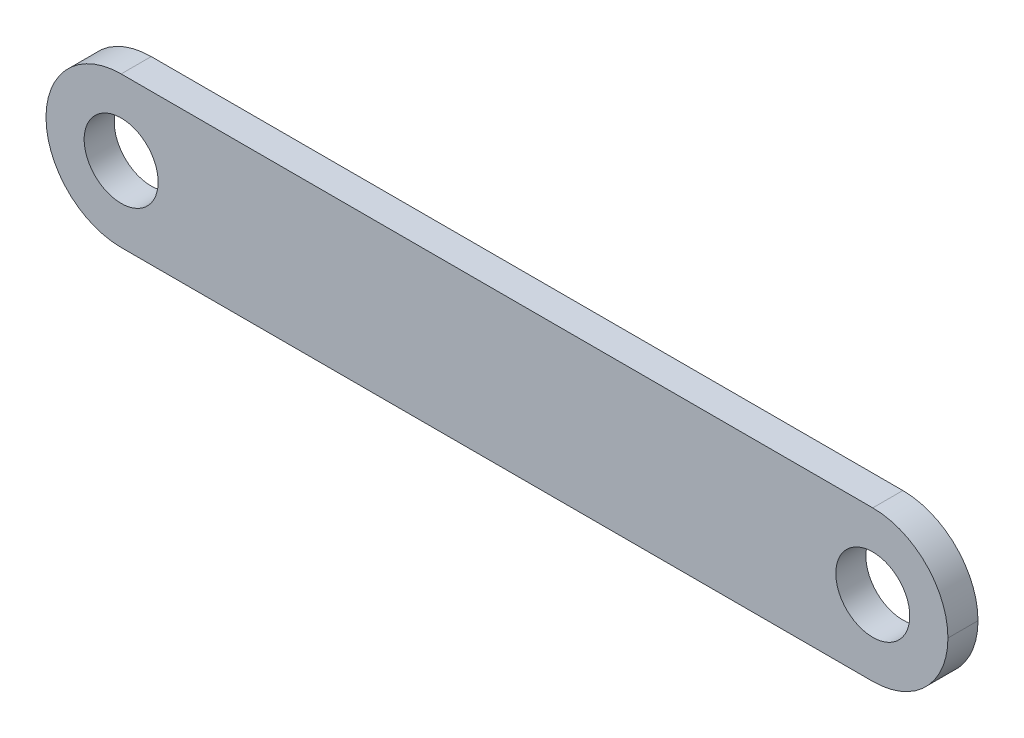
ISO-10303-21;
HEADER;
FILE_DESCRIPTION(('STEP AP214'),'2;1');
FILE_NAME('part.step','',(''),(''),'','','');
FILE_SCHEMA(('AUTOMOTIVE_DESIGN { 1 0 10303 214 1 1 1 1 }'));
ENDSEC;
DATA;
#1=APPLICATION_CONTEXT('core data for automotive mechanical design processes');
#2=APPLICATION_PROTOCOL_DEFINITION('international standard','automotive_design',2000,#1);
#3=PRODUCT_CONTEXT('',#1,'mechanical');
#4=PRODUCT('Part','Part','',(#3));
#5=PRODUCT_RELATED_PRODUCT_CATEGORY('part','',(#4));
#6=PRODUCT_DEFINITION_FORMATION('','',#4);
#7=PRODUCT_DEFINITION_CONTEXT('part definition',#1,'design');
#8=PRODUCT_DEFINITION('design','',#6,#7);
#9=PRODUCT_DEFINITION_SHAPE('','',#8);
#10=(LENGTH_UNIT() NAMED_UNIT(*) SI_UNIT(.MILLI.,.METRE.));
#11=(NAMED_UNIT(*) PLANE_ANGLE_UNIT() SI_UNIT($,.RADIAN.));
#12=(NAMED_UNIT(*) SI_UNIT($,.STERADIAN.) SOLID_ANGLE_UNIT());
#13=UNCERTAINTY_MEASURE_WITH_UNIT(LENGTH_MEASURE(1.E-05),#10,'distance_accuracy_value','');
#14=(GEOMETRIC_REPRESENTATION_CONTEXT(3) GLOBAL_UNCERTAINTY_ASSIGNED_CONTEXT((#13)) GLOBAL_UNIT_ASSIGNED_CONTEXT((#10,
#11,#12)) REPRESENTATION_CONTEXT('',''));
#15=CARTESIAN_POINT('',(0.,0.,0.));
#16=DIRECTION('',(0.,0.,1.));
#17=DIRECTION('',(1.,0.,0.));
#18=AXIS2_PLACEMENT_3D('',#15,#16,#17);
#19=CARTESIAN_POINT('',(-76.2,12.7,5.08));
#20=DIRECTION('',(0.,-1.,0.));
#21=DIRECTION('',(0.,0.,-1.));
#22=AXIS2_PLACEMENT_3D('',#19,#20,#21);
#23=PLANE('',#22);
#24=DIRECTION('',(-1.,0.,0.));
#25=VECTOR('',#24,1.);
#26=CARTESIAN_POINT('',(-76.2,12.7,0.));
#27=LINE('',#26,#25);
#28=CARTESIAN_POINT('',(63.4999999999999,12.7,0.));
#29=VERTEX_POINT('',#28);
#30=CARTESIAN_POINT('',(-63.5,12.7,0.));
#31=VERTEX_POINT('',#30);
#32=EDGE_CURVE('E126',#29,#31,#27,.T.);
#33=ORIENTED_EDGE('',*,*,#32,.T.);
#34=DIRECTION('',(0.,0.,-1.));
#35=VECTOR('',#34,1.);
#36=CARTESIAN_POINT('',(-63.5,12.7,5.08));
#37=LINE('',#36,#35);
#38=CARTESIAN_POINT('',(-63.5,12.7,5.08));
#39=VERTEX_POINT('',#38);
#40=EDGE_CURVE('E11',#31,#39,#37,.F.);
#41=ORIENTED_EDGE('',*,*,#40,.T.);
#42=DIRECTION('',(-1.,0.,0.));
#43=VECTOR('',#42,1.);
#44=CARTESIAN_POINT('',(-76.2,12.7,5.08));
#45=LINE('',#44,#43);
#46=CARTESIAN_POINT('',(63.4999999999999,12.7,5.08));
#47=VERTEX_POINT('',#46);
#48=EDGE_CURVE('E125',#47,#39,#45,.T.);
#49=ORIENTED_EDGE('',*,*,#48,.F.);
#50=DIRECTION('',(0.,0.,-1.));
#51=VECTOR('',#50,1.);
#52=CARTESIAN_POINT('',(63.5,12.7,5.08));
#53=LINE('',#52,#51);
#54=EDGE_CURVE('E52',#47,#29,#53,.T.);
#55=ORIENTED_EDGE('',*,*,#54,.T.);
#56=EDGE_LOOP('',(#33,#41,#49,#55));
#57=FACE_BOUND('',#56,.T.);
#58=ADVANCED_FACE('F43',(#57),#23,.F.);
#59=CARTESIAN_POINT('',(-76.2,-12.7,5.08));
#60=DIRECTION('',(0.,1.,0.));
#61=DIRECTION('',(0.,0.,1.));
#62=AXIS2_PLACEMENT_3D('',#59,#60,#61);
#63=PLANE('',#62);
#64=DIRECTION('',(1.,0.,0.));
#65=VECTOR('',#64,1.);
#66=CARTESIAN_POINT('',(-76.2,-12.7,5.08));
#67=LINE('',#66,#65);
#68=CARTESIAN_POINT('',(-63.5,-12.7,5.08));
#69=VERTEX_POINT('',#68);
#70=CARTESIAN_POINT('',(63.4999999999999,-12.7,5.08));
#71=VERTEX_POINT('',#70);
#72=EDGE_CURVE('E118',#69,#71,#67,.T.);
#73=ORIENTED_EDGE('',*,*,#72,.F.);
#74=DIRECTION('',(0.,0.,-1.));
#75=VECTOR('',#74,1.);
#76=CARTESIAN_POINT('',(-63.5,-12.7,5.08));
#77=LINE('',#76,#75);
#78=CARTESIAN_POINT('',(-63.5,-12.7,0.));
#79=VERTEX_POINT('',#78);
#80=EDGE_CURVE('E102',#69,#79,#77,.T.);
#81=ORIENTED_EDGE('',*,*,#80,.T.);
#82=DIRECTION('',(1.,0.,0.));
#83=VECTOR('',#82,1.);
#84=CARTESIAN_POINT('',(-76.2,-12.7,0.));
#85=LINE('',#84,#83);
#86=CARTESIAN_POINT('',(63.4999999999999,-12.7,0.));
#87=VERTEX_POINT('',#86);
#88=EDGE_CURVE('E115',#79,#87,#85,.T.);
#89=ORIENTED_EDGE('',*,*,#88,.T.);
#90=DIRECTION('',(0.,0.,-1.));
#91=VECTOR('',#90,1.);
#92=CARTESIAN_POINT('',(63.5,-12.7,5.08));
#93=LINE('',#92,#91);
#94=EDGE_CURVE('E120',#87,#71,#93,.F.);
#95=ORIENTED_EDGE('',*,*,#94,.T.);
#96=EDGE_LOOP('',(#73,#81,#89,#95));
#97=FACE_BOUND('',#96,.T.);
#98=ADVANCED_FACE('F113',(#97),#63,.F.);
#99=CARTESIAN_POINT('',(0.,0.,5.08));
#100=DIRECTION('',(0.,0.,-1.));
#101=DIRECTION('',(-1.,0.,0.));
#102=AXIS2_PLACEMENT_3D('',#99,#100,#101);
#103=PLANE('',#102);
#104=CARTESIAN_POINT('',(-63.5,0.,5.08));
#105=DIRECTION('',(0.,0.,1.));
#106=DIRECTION('',(1.,0.,0.));
#107=AXIS2_PLACEMENT_3D('',#104,#105,#106);
#108=CIRCLE('',#107,6.24999999999999);
#109=CARTESIAN_POINT('',(-57.25,0.,5.08));
#110=VERTEX_POINT('',#109);
#111=EDGE_CURVE('E143',#110,#110,#108,.T.);
#112=ORIENTED_EDGE('',*,*,#111,.F.);
#113=EDGE_LOOP('',(#112));
#114=FACE_BOUND('',#113,.T.);
#115=CARTESIAN_POINT('',(63.5,0.,5.08));
#116=DIRECTION('',(0.,0.,1.));
#117=DIRECTION('',(1.,0.,0.));
#118=AXIS2_PLACEMENT_3D('',#115,#116,#117);
#119=CIRCLE('',#118,6.24999999999999);
#120=CARTESIAN_POINT('',(69.75,0.,5.08));
#121=VERTEX_POINT('',#120);
#122=EDGE_CURVE('E162',#121,#121,#119,.T.);
#123=ORIENTED_EDGE('',*,*,#122,.F.);
#124=EDGE_LOOP('',(#123));
#125=FACE_BOUND('',#124,.T.);
#126=CARTESIAN_POINT('',(-63.5,0.,5.08));
#127=DIRECTION('',(0.,0.,-1.));
#128=DIRECTION('',(-1.,0.,0.));
#129=AXIS2_PLACEMENT_3D('',#126,#127,#128);
#130=CIRCLE('',#129,12.7);
#131=CARTESIAN_POINT('',(-76.2,0.,5.08));
#132=VERTEX_POINT('',#131);
#133=EDGE_CURVE('E60',#39,#132,#130,.F.);
#134=ORIENTED_EDGE('',*,*,#133,.T.);
#135=CARTESIAN_POINT('',(-63.5,0.,5.08));
#136=DIRECTION('',(0.,0.,-1.));
#137=DIRECTION('',(-1.,0.,0.));
#138=AXIS2_PLACEMENT_3D('',#135,#136,#137);
#139=CIRCLE('',#138,12.7);
#140=EDGE_CURVE('E141',#132,#69,#139,.F.);
#141=ORIENTED_EDGE('',*,*,#140,.T.);
#142=ORIENTED_EDGE('',*,*,#72,.T.);
#143=CARTESIAN_POINT('',(63.5,0.,5.08));
#144=DIRECTION('',(0.,0.,-1.));
#145=DIRECTION('',(-1.,0.,0.));
#146=AXIS2_PLACEMENT_3D('',#143,#144,#145);
#147=CIRCLE('',#146,12.7);
#148=CARTESIAN_POINT('',(76.2,0.,5.08));
#149=VERTEX_POINT('',#148);
#150=EDGE_CURVE('E138',#71,#149,#147,.F.);
#151=ORIENTED_EDGE('',*,*,#150,.T.);
#152=CARTESIAN_POINT('',(63.5,0.,5.08));
#153=DIRECTION('',(0.,0.,-1.));
#154=DIRECTION('',(-1.,0.,0.));
#155=AXIS2_PLACEMENT_3D('',#152,#153,#154);
#156=CIRCLE('',#155,12.7);
#157=EDGE_CURVE('E107',#149,#47,#156,.F.);
#158=ORIENTED_EDGE('',*,*,#157,.T.);
#159=ORIENTED_EDGE('',*,*,#48,.T.);
#160=EDGE_LOOP('',(#134,#141,#142,#151,#158,#159));
#161=FACE_BOUND('',#160,.T.);
#162=ADVANCED_FACE('F155',(#114,#125,#161),#103,.F.);
#163=CARTESIAN_POINT('',(0.,0.,0.));
#164=DIRECTION('',(0.,0.,-1.));
#165=DIRECTION('',(-1.,0.,0.));
#166=AXIS2_PLACEMENT_3D('',#163,#164,#165);
#167=PLANE('',#166);
#168=CARTESIAN_POINT('',(-63.5,0.,0.));
#169=DIRECTION('',(0.,0.,1.));
#170=DIRECTION('',(1.,0.,0.));
#171=AXIS2_PLACEMENT_3D('',#168,#169,#170);
#172=CIRCLE('',#171,6.25);
#173=CARTESIAN_POINT('',(-57.25,0.,0.));
#174=VERTEX_POINT('',#173);
#175=EDGE_CURVE('E145',#174,#174,#172,.T.);
#176=ORIENTED_EDGE('',*,*,#175,.T.);
#177=EDGE_LOOP('',(#176));
#178=FACE_BOUND('',#177,.T.);
#179=CARTESIAN_POINT('',(63.5,0.,0.));
#180=DIRECTION('',(0.,0.,1.));
#181=DIRECTION('',(1.,0.,0.));
#182=AXIS2_PLACEMENT_3D('',#179,#180,#181);
#183=CIRCLE('',#182,6.25000000000001);
#184=CARTESIAN_POINT('',(69.75,0.,0.));
#185=VERTEX_POINT('',#184);
#186=EDGE_CURVE('E129',#185,#185,#183,.T.);
#187=ORIENTED_EDGE('',*,*,#186,.T.);
#188=EDGE_LOOP('',(#187));
#189=FACE_BOUND('',#188,.T.);
#190=ORIENTED_EDGE('',*,*,#88,.F.);
#191=CARTESIAN_POINT('',(-63.5,0.,0.));
#192=DIRECTION('',(0.,0.,-1.));
#193=DIRECTION('',(-1.,0.,0.));
#194=AXIS2_PLACEMENT_3D('',#191,#192,#193);
#195=CIRCLE('',#194,12.7);
#196=CARTESIAN_POINT('',(-76.2,0.,0.));
#197=VERTEX_POINT('',#196);
#198=EDGE_CURVE('E98',#79,#197,#195,.T.);
#199=ORIENTED_EDGE('',*,*,#198,.T.);
#200=CARTESIAN_POINT('',(-63.5,0.,0.));
#201=DIRECTION('',(0.,0.,-1.));
#202=DIRECTION('',(-1.,0.,0.));
#203=AXIS2_PLACEMENT_3D('',#200,#201,#202);
#204=CIRCLE('',#203,12.7);
#205=EDGE_CURVE('E108',#197,#31,#204,.T.);
#206=ORIENTED_EDGE('',*,*,#205,.T.);
#207=ORIENTED_EDGE('',*,*,#32,.F.);
#208=CARTESIAN_POINT('',(63.5,0.,0.));
#209=DIRECTION('',(0.,0.,-1.));
#210=DIRECTION('',(-1.,0.,0.));
#211=AXIS2_PLACEMENT_3D('',#208,#209,#210);
#212=CIRCLE('',#211,12.7);
#213=CARTESIAN_POINT('',(76.2,0.,0.));
#214=VERTEX_POINT('',#213);
#215=EDGE_CURVE('E119',#29,#214,#212,.T.);
#216=ORIENTED_EDGE('',*,*,#215,.T.);
#217=CARTESIAN_POINT('',(63.5,0.,0.));
#218=DIRECTION('',(0.,0.,-1.));
#219=DIRECTION('',(-1.,0.,0.));
#220=AXIS2_PLACEMENT_3D('',#217,#218,#219);
#221=CIRCLE('',#220,12.7);
#222=EDGE_CURVE('E124',#214,#87,#221,.T.);
#223=ORIENTED_EDGE('',*,*,#222,.T.);
#224=EDGE_LOOP('',(#190,#199,#206,#207,#216,#223));
#225=FACE_BOUND('',#224,.T.);
#226=ADVANCED_FACE('F122',(#178,#189,#225),#167,.T.);
#227=CARTESIAN_POINT('',(63.5,0.,5.08));
#228=DIRECTION('',(0.,0.,1.));
#229=DIRECTION('',(1.,0.,0.));
#230=AXIS2_PLACEMENT_3D('',#227,#228,#229);
#231=CYLINDRICAL_SURFACE('',#230,6.25);
#232=ORIENTED_EDGE('',*,*,#186,.F.);
#233=EDGE_LOOP('',(#232));
#234=FACE_BOUND('',#233,.T.);
#235=ORIENTED_EDGE('',*,*,#122,.T.);
#236=EDGE_LOOP('',(#235));
#237=FACE_BOUND('',#236,.T.);
#238=ADVANCED_FACE('F173',(#234,#237),#231,.F.);
#239=CARTESIAN_POINT('',(-63.5,0.,5.08));
#240=DIRECTION('',(0.,0.,1.));
#241=DIRECTION('',(1.,0.,0.));
#242=AXIS2_PLACEMENT_3D('',#239,#240,#241);
#243=CYLINDRICAL_SURFACE('',#242,6.25);
#244=ORIENTED_EDGE('',*,*,#175,.F.);
#245=EDGE_LOOP('',(#244));
#246=FACE_BOUND('',#245,.T.);
#247=ORIENTED_EDGE('',*,*,#111,.T.);
#248=EDGE_LOOP('',(#247));
#249=FACE_BOUND('',#248,.T.);
#250=ADVANCED_FACE('F170',(#246,#249),#243,.F.);
#251=CARTESIAN_POINT('',(-63.5,0.,5.08));
#252=DIRECTION('',(0.,0.,-1.));
#253=DIRECTION('',(-1.,0.,0.));
#254=AXIS2_PLACEMENT_3D('',#251,#252,#253);
#255=CYLINDRICAL_SURFACE('',#254,12.7);
#256=DIRECTION('',(0.,0.,-1.));
#257=VECTOR('',#256,1.);
#258=CARTESIAN_POINT('',(-76.2,0.,5.08));
#259=LINE('',#258,#257);
#260=EDGE_CURVE('E103',#132,#197,#259,.T.);
#261=ORIENTED_EDGE('',*,*,#260,.F.);
#262=ORIENTED_EDGE('',*,*,#133,.F.);
#263=ORIENTED_EDGE('',*,*,#40,.F.);
#264=ORIENTED_EDGE('',*,*,#205,.F.);
#265=EDGE_LOOP('',(#261,#262,#263,#264));
#266=FACE_BOUND('',#265,.T.);
#267=ADVANCED_FACE('F158',(#266),#255,.T.);
#268=CARTESIAN_POINT('',(-63.5,0.,5.08));
#269=DIRECTION('',(0.,0.,-1.));
#270=DIRECTION('',(-1.,0.,0.));
#271=AXIS2_PLACEMENT_3D('',#268,#269,#270);
#272=CYLINDRICAL_SURFACE('',#271,12.7);
#273=ORIENTED_EDGE('',*,*,#140,.F.);
#274=ORIENTED_EDGE('',*,*,#260,.T.);
#275=ORIENTED_EDGE('',*,*,#198,.F.);
#276=ORIENTED_EDGE('',*,*,#80,.F.);
#277=EDGE_LOOP('',(#273,#274,#275,#276));
#278=FACE_BOUND('',#277,.T.);
#279=ADVANCED_FACE('F101',(#278),#272,.T.);
#280=CARTESIAN_POINT('',(63.5,0.,5.08));
#281=DIRECTION('',(0.,0.,-1.));
#282=DIRECTION('',(-1.,0.,0.));
#283=AXIS2_PLACEMENT_3D('',#280,#281,#282);
#284=CYLINDRICAL_SURFACE('',#283,12.7);
#285=ORIENTED_EDGE('',*,*,#54,.F.);
#286=ORIENTED_EDGE('',*,*,#157,.F.);
#287=DIRECTION('',(0.,0.,-1.));
#288=VECTOR('',#287,1.);
#289=CARTESIAN_POINT('',(76.2,0.,5.08));
#290=LINE('',#289,#288);
#291=EDGE_CURVE('E47',#214,#149,#290,.F.);
#292=ORIENTED_EDGE('',*,*,#291,.F.);
#293=ORIENTED_EDGE('',*,*,#215,.F.);
#294=EDGE_LOOP('',(#285,#286,#292,#293));
#295=FACE_BOUND('',#294,.T.);
#296=ADVANCED_FACE('F45',(#295),#284,.T.);
#297=CARTESIAN_POINT('',(63.5,0.,5.08));
#298=DIRECTION('',(0.,0.,-1.));
#299=DIRECTION('',(-1.,0.,0.));
#300=AXIS2_PLACEMENT_3D('',#297,#298,#299);
#301=CYLINDRICAL_SURFACE('',#300,12.7);
#302=ORIENTED_EDGE('',*,*,#150,.F.);
#303=ORIENTED_EDGE('',*,*,#94,.F.);
#304=ORIENTED_EDGE('',*,*,#222,.F.);
#305=ORIENTED_EDGE('',*,*,#291,.T.);
#306=EDGE_LOOP('',(#302,#303,#304,#305));
#307=FACE_BOUND('',#306,.T.);
#308=ADVANCED_FACE('F150',(#307),#301,.T.);
#309=CLOSED_SHELL('',(#58,#98,#162,#226,#238,#250,#267,#279,#296,#308));
#310=MANIFOLD_SOLID_BREP('B2',#309);
#311=ADVANCED_BREP_SHAPE_REPRESENTATION('',(#18,#310),#14);
#312=SHAPE_DEFINITION_REPRESENTATION(#9,#311);
ENDSEC;
END-ISO-10303-21;
